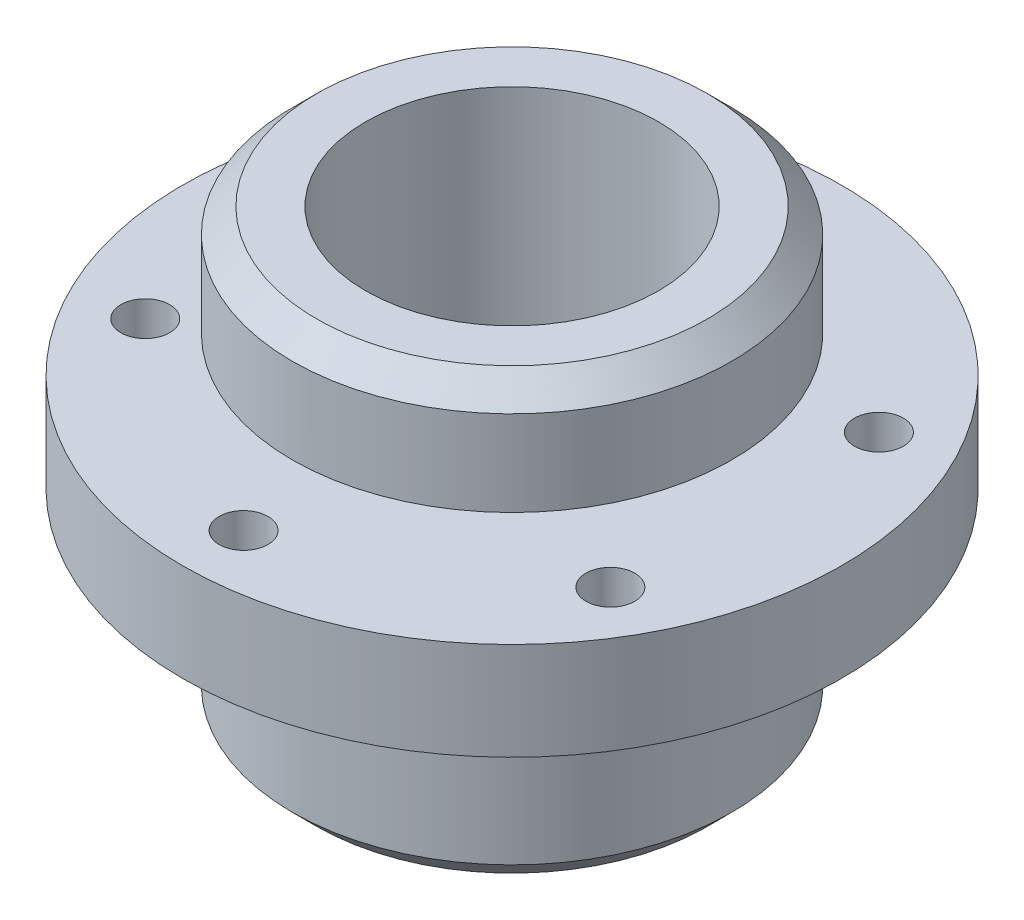
ISO-10303-21;
HEADER;
FILE_DESCRIPTION(('STEP AP214'),'2;1');
FILE_NAME('part.step','',(''),(''),'','','');
FILE_SCHEMA(('AUTOMOTIVE_DESIGN { 1 0 10303 214 1 1 1 1 }'));
ENDSEC;
DATA;
#1=APPLICATION_CONTEXT('core data for automotive mechanical design processes');
#2=APPLICATION_PROTOCOL_DEFINITION('international standard','automotive_design',2000,#1);
#3=PRODUCT_CONTEXT('',#1,'mechanical');
#4=PRODUCT('Part','Part','',(#3));
#5=PRODUCT_RELATED_PRODUCT_CATEGORY('part','',(#4));
#6=PRODUCT_DEFINITION_FORMATION('','',#4);
#7=PRODUCT_DEFINITION_CONTEXT('part definition',#1,'design');
#8=PRODUCT_DEFINITION('design','',#6,#7);
#9=PRODUCT_DEFINITION_SHAPE('','',#8);
#10=(LENGTH_UNIT() NAMED_UNIT(*) SI_UNIT(.MILLI.,.METRE.));
#11=(NAMED_UNIT(*) PLANE_ANGLE_UNIT() SI_UNIT($,.RADIAN.));
#12=(NAMED_UNIT(*) SI_UNIT($,.STERADIAN.) SOLID_ANGLE_UNIT());
#13=UNCERTAINTY_MEASURE_WITH_UNIT(LENGTH_MEASURE(1.E-05),#10,'distance_accuracy_value','');
#14=(GEOMETRIC_REPRESENTATION_CONTEXT(3) GLOBAL_UNCERTAINTY_ASSIGNED_CONTEXT((#13)) GLOBAL_UNIT_ASSIGNED_CONTEXT((#10,
#11,#12)) REPRESENTATION_CONTEXT('',''));
#15=CARTESIAN_POINT('',(0.,0.,0.));
#16=DIRECTION('',(0.,0.,1.));
#17=DIRECTION('',(1.,0.,0.));
#18=AXIS2_PLACEMENT_3D('',#15,#16,#17);
#19=CARTESIAN_POINT('',(0.,63.4080227866128,0.));
#20=DIRECTION('',(0.,1.,0.));
#21=DIRECTION('',(0.,0.,1.));
#22=AXIS2_PLACEMENT_3D('',#19,#20,#21);
#23=CYLINDRICAL_SURFACE('',#22,36.);
#24=CARTESIAN_POINT('',(0.,-42.7154046997389,0.));
#25=DIRECTION('',(0.,1.,0.));
#26=DIRECTION('',(0.,0.,1.));
#27=AXIS2_PLACEMENT_3D('',#24,#25,#26);
#28=CIRCLE('',#27,36.);
#29=CARTESIAN_POINT('',(0.,-42.7154046997389,36.));
#30=VERTEX_POINT('',#29);
#31=EDGE_CURVE('E62',#30,#30,#28,.T.);
#32=ORIENTED_EDGE('',*,*,#31,.T.);
#33=EDGE_LOOP('',(#32));
#34=FACE_BOUND('',#33,.T.);
#35=CARTESIAN_POINT('',(0.,-22.7154046997389,0.));
#36=DIRECTION('',(0.,1.,0.));
#37=DIRECTION('',(0.,0.,1.));
#38=AXIS2_PLACEMENT_3D('',#35,#36,#37);
#39=CIRCLE('',#38,36.);
#40=CARTESIAN_POINT('',(0.,-22.7154046997389,36.));
#41=VERTEX_POINT('',#40);
#42=EDGE_CURVE('E71',#41,#41,#39,.T.);
#43=ORIENTED_EDGE('',*,*,#42,.F.);
#44=EDGE_LOOP('',(#43));
#45=FACE_BOUND('',#44,.T.);
#46=ADVANCED_FACE('F39',(#34,#45),#23,.T.);
#47=CARTESIAN_POINT('',(36.,-22.7154046997389,0.));
#48=DIRECTION('',(0.,-1.,0.));
#49=DIRECTION('',(0.,0.,-1.));
#50=AXIS2_PLACEMENT_3D('',#47,#48,#49);
#51=PLANE('',#50);
#52=CARTESIAN_POINT('',(0.,-22.7154046997389,0.));
#53=DIRECTION('',(0.,-1.,0.));
#54=DIRECTION('',(0.,0.,-1.));
#55=AXIS2_PLACEMENT_3D('',#52,#53,#54);
#56=CIRCLE('',#55,31.1644908616188);
#57=CARTESIAN_POINT('',(0.,-22.7154046997389,-31.1644908616188));
#58=VERTEX_POINT('',#57);
#59=EDGE_CURVE('E50',#58,#58,#56,.T.);
#60=ORIENTED_EDGE('',*,*,#59,.T.);
#61=EDGE_LOOP('',(#60));
#62=FACE_BOUND('',#61,.T.);
#63=ORIENTED_EDGE('',*,*,#42,.T.);
#64=EDGE_LOOP('',(#63));
#65=FACE_BOUND('',#64,.T.);
#66=ADVANCED_FACE('F163',(#62,#65),#51,.F.);
#67=CARTESIAN_POINT('',(0.,63.4080227866128,0.));
#68=DIRECTION('',(0.,1.,0.));
#69=DIRECTION('',(0.,0.,1.));
#70=AXIS2_PLACEMENT_3D('',#67,#68,#69);
#71=CYLINDRICAL_SURFACE('',#70,27.1644908616188);
#72=CARTESIAN_POINT('',(0.,-18.7154046997389,0.));
#73=DIRECTION('',(0.,-1.,0.));
#74=DIRECTION('',(0.,0.,-1.));
#75=AXIS2_PLACEMENT_3D('',#72,#73,#74);
#76=CIRCLE('',#75,27.1644908616188);
#77=CARTESIAN_POINT('',(0.,-18.7154046997389,-27.1644908616188));
#78=VERTEX_POINT('',#77);
#79=EDGE_CURVE('E54',#78,#78,#76,.F.);
#80=ORIENTED_EDGE('',*,*,#79,.T.);
#81=EDGE_LOOP('',(#80));
#82=FACE_BOUND('',#81,.T.);
#83=CARTESIAN_POINT('',(0.,-14.7154046997389,0.));
#84=DIRECTION('',(0.,1.,0.));
#85=DIRECTION('',(0.,0.,1.));
#86=AXIS2_PLACEMENT_3D('',#83,#84,#85);
#87=CIRCLE('',#86,27.1644908616188);
#88=CARTESIAN_POINT('',(0.,-14.7154046997389,27.1644908616188));
#89=VERTEX_POINT('',#88);
#90=EDGE_CURVE('E74',#89,#89,#87,.T.);
#91=ORIENTED_EDGE('',*,*,#90,.F.);
#92=EDGE_LOOP('',(#91));
#93=FACE_BOUND('',#92,.T.);
#94=ADVANCED_FACE('F157',(#82,#93),#71,.T.);
#95=CARTESIAN_POINT('',(27.1644908616188,-14.7154046997389,0.));
#96=DIRECTION('',(0.,1.,0.));
#97=DIRECTION('',(0.,0.,1.));
#98=AXIS2_PLACEMENT_3D('',#95,#96,#97);
#99=PLANE('',#98);
#100=CARTESIAN_POINT('',(38.105117766515,-14.7154046997389,-22.0000000000004));
#101=DIRECTION('',(0.,1.,0.));
#102=DIRECTION('',(0.,0.,1.));
#103=AXIS2_PLACEMENT_3D('',#100,#101,#102);
#104=CIRCLE('',#103,4.);
#105=CARTESIAN_POINT('',(38.105117766515,-14.7154046997389,-18.0000000000004));
#106=VERTEX_POINT('',#105);
#107=EDGE_CURVE('E108',#106,#106,#104,.F.);
#108=ORIENTED_EDGE('',*,*,#107,.F.);
#109=EDGE_LOOP('',(#108));
#110=FACE_BOUND('',#109,.T.);
#111=CARTESIAN_POINT('',(38.1051177665155,-14.7154046997389,21.9999999999996));
#112=DIRECTION('',(0.,1.,0.));
#113=DIRECTION('',(0.,0.,1.));
#114=AXIS2_PLACEMENT_3D('',#111,#112,#113);
#115=CIRCLE('',#114,4.);
#116=CARTESIAN_POINT('',(38.1051177665155,-14.7154046997389,25.9999999999996));
#117=VERTEX_POINT('',#116);
#118=EDGE_CURVE('E115',#117,#117,#115,.F.);
#119=ORIENTED_EDGE('',*,*,#118,.F.);
#120=EDGE_LOOP('',(#119));
#121=FACE_BOUND('',#120,.T.);
#122=CARTESIAN_POINT('',(0.,-14.7154046997389,44.));
#123=DIRECTION('',(0.,1.,0.));
#124=DIRECTION('',(0.,0.,1.));
#125=AXIS2_PLACEMENT_3D('',#122,#123,#124);
#126=CIRCLE('',#125,4.);
#127=CARTESIAN_POINT('',(0.,-14.7154046997389,48.));
#128=VERTEX_POINT('',#127);
#129=EDGE_CURVE('E121',#128,#128,#126,.F.);
#130=ORIENTED_EDGE('',*,*,#129,.F.);
#131=EDGE_LOOP('',(#130));
#132=FACE_BOUND('',#131,.T.);
#133=CARTESIAN_POINT('',(-38.1051177665152,-14.7154046997389,22.0000000000002));
#134=DIRECTION('',(0.,1.,0.));
#135=DIRECTION('',(0.,0.,1.));
#136=AXIS2_PLACEMENT_3D('',#133,#134,#135);
#137=CIRCLE('',#136,4.);
#138=CARTESIAN_POINT('',(-38.1051177665152,-14.7154046997389,26.0000000000002));
#139=VERTEX_POINT('',#138);
#140=EDGE_CURVE('E107',#139,#139,#137,.F.);
#141=ORIENTED_EDGE('',*,*,#140,.F.);
#142=EDGE_LOOP('',(#141));
#143=FACE_BOUND('',#142,.T.);
#144=CARTESIAN_POINT('',(-38.1051177665153,-14.7154046997389,-21.9999999999999));
#145=DIRECTION('',(0.,1.,0.));
#146=DIRECTION('',(0.,0.,1.));
#147=AXIS2_PLACEMENT_3D('',#144,#145,#146);
#148=CIRCLE('',#147,4.);
#149=CARTESIAN_POINT('',(-38.1051177665153,-14.7154046997389,-17.9999999999999));
#150=VERTEX_POINT('',#149);
#151=EDGE_CURVE('E101',#150,#150,#148,.F.);
#152=ORIENTED_EDGE('',*,*,#151,.F.);
#153=EDGE_LOOP('',(#152));
#154=FACE_BOUND('',#153,.T.);
#155=CARTESIAN_POINT('',(0.,-14.7154046997389,-44.));
#156=DIRECTION('',(0.,1.,0.));
#157=DIRECTION('',(0.,0.,1.));
#158=AXIS2_PLACEMENT_3D('',#155,#156,#157);
#159=CIRCLE('',#158,4.);
#160=CARTESIAN_POINT('',(0.,-14.7154046997389,-40.));
#161=VERTEX_POINT('',#160);
#162=EDGE_CURVE('E95',#161,#161,#159,.F.);
#163=ORIENTED_EDGE('',*,*,#162,.F.);
#164=EDGE_LOOP('',(#163));
#165=FACE_BOUND('',#164,.T.);
#166=CARTESIAN_POINT('',(0.,-14.7154046997389,0.));
#167=DIRECTION('',(0.,1.,0.));
#168=DIRECTION('',(0.,0.,1.));
#169=AXIS2_PLACEMENT_3D('',#166,#167,#168);
#170=CIRCLE('',#169,54.);
#171=CARTESIAN_POINT('',(0.,-14.7154046997389,54.));
#172=VERTEX_POINT('',#171);
#173=EDGE_CURVE('E77',#172,#172,#170,.T.);
#174=ORIENTED_EDGE('',*,*,#173,.F.);
#175=EDGE_LOOP('',(#174));
#176=FACE_BOUND('',#175,.T.);
#177=ORIENTED_EDGE('',*,*,#90,.T.);
#178=EDGE_LOOP('',(#177));
#179=FACE_BOUND('',#178,.T.);
#180=ADVANCED_FACE('F151',(#110,#121,#132,#143,#154,#165,#176,#179),#99,.F.);
#181=CARTESIAN_POINT('',(0.,63.4080227866128,0.));
#182=DIRECTION('',(0.,1.,0.));
#183=DIRECTION('',(0.,0.,1.));
#184=AXIS2_PLACEMENT_3D('',#181,#182,#183);
#185=CYLINDRICAL_SURFACE('',#184,54.);
#186=CARTESIAN_POINT('',(0.,1.28459530026111,0.));
#187=DIRECTION('',(0.,1.,0.));
#188=DIRECTION('',(0.,0.,1.));
#189=AXIS2_PLACEMENT_3D('',#186,#187,#188);
#190=CIRCLE('',#189,54.);
#191=CARTESIAN_POINT('',(0.,1.28459530026111,54.));
#192=VERTEX_POINT('',#191);
#193=EDGE_CURVE('E80',#192,#192,#190,.T.);
#194=ORIENTED_EDGE('',*,*,#193,.F.);
#195=EDGE_LOOP('',(#194));
#196=FACE_BOUND('',#195,.T.);
#197=ORIENTED_EDGE('',*,*,#173,.T.);
#198=EDGE_LOOP('',(#197));
#199=FACE_BOUND('',#198,.T.);
#200=ADVANCED_FACE('F138',(#196,#199),#185,.T.);
#201=CARTESIAN_POINT('',(54.,1.28459530026111,0.));
#202=DIRECTION('',(0.,-1.,0.));
#203=DIRECTION('',(0.,0.,-1.));
#204=AXIS2_PLACEMENT_3D('',#201,#202,#203);
#205=PLANE('',#204);
#206=CARTESIAN_POINT('',(38.105117766515,1.28459530026111,-22.0000000000004));
#207=DIRECTION('',(0.,1.,0.));
#208=DIRECTION('',(-0.866025403784433,0.,0.50000000000001));
#209=AXIS2_PLACEMENT_3D('',#206,#207,#208);
#210=CIRCLE('',#209,4.);
#211=CARTESIAN_POINT('',(34.6410161513773,1.28459530026111,-20.0000000000004));
#212=VERTEX_POINT('',#211);
#213=EDGE_CURVE('E112',#212,#212,#210,.T.);
#214=ORIENTED_EDGE('',*,*,#213,.F.);
#215=EDGE_LOOP('',(#214));
#216=FACE_BOUND('',#215,.T.);
#217=CARTESIAN_POINT('',(38.1051177665155,1.28459530026111,21.9999999999996));
#218=DIRECTION('',(0.,1.,0.));
#219=DIRECTION('',(-0.866025403784443,0.,-0.499999999999992));
#220=AXIS2_PLACEMENT_3D('',#217,#218,#219);
#221=CIRCLE('',#220,4.);
#222=CARTESIAN_POINT('',(34.6410161513777,1.28459530026111,19.9999999999997));
#223=VERTEX_POINT('',#222);
#224=EDGE_CURVE('E111',#223,#223,#221,.T.);
#225=ORIENTED_EDGE('',*,*,#224,.F.);
#226=EDGE_LOOP('',(#225));
#227=FACE_BOUND('',#226,.T.);
#228=CARTESIAN_POINT('',(0.,1.28459530026111,44.));
#229=DIRECTION('',(0.,1.,0.));
#230=DIRECTION('',(0.,0.,-1.));
#231=AXIS2_PLACEMENT_3D('',#228,#229,#230);
#232=CIRCLE('',#231,4.);
#233=CARTESIAN_POINT('',(0.,1.28459530026111,40.));
#234=VERTEX_POINT('',#233);
#235=EDGE_CURVE('E118',#234,#234,#232,.T.);
#236=ORIENTED_EDGE('',*,*,#235,.F.);
#237=EDGE_LOOP('',(#236));
#238=FACE_BOUND('',#237,.T.);
#239=CARTESIAN_POINT('',(-38.1051177665152,1.28459530026111,22.0000000000002));
#240=DIRECTION('',(0.,1.,0.));
#241=DIRECTION('',(0.866025403784436,0.,-0.500000000000004));
#242=AXIS2_PLACEMENT_3D('',#239,#240,#241);
#243=CIRCLE('',#242,4.);
#244=CARTESIAN_POINT('',(-34.6410161513775,1.28459530026111,20.0000000000002));
#245=VERTEX_POINT('',#244);
#246=EDGE_CURVE('E124',#245,#245,#243,.T.);
#247=ORIENTED_EDGE('',*,*,#246,.F.);
#248=EDGE_LOOP('',(#247));
#249=FACE_BOUND('',#248,.T.);
#250=CARTESIAN_POINT('',(-38.1051177665153,1.28459530026111,-21.9999999999999));
#251=DIRECTION('',(0.,1.,0.));
#252=DIRECTION('',(0.86602540378444,0.,0.499999999999998));
#253=AXIS2_PLACEMENT_3D('',#250,#251,#252);
#254=CIRCLE('',#253,4.);
#255=CARTESIAN_POINT('',(-34.6410161513776,1.28459530026111,-19.9999999999999));
#256=VERTEX_POINT('',#255);
#257=EDGE_CURVE('E104',#256,#256,#254,.T.);
#258=ORIENTED_EDGE('',*,*,#257,.F.);
#259=EDGE_LOOP('',(#258));
#260=FACE_BOUND('',#259,.T.);
#261=CARTESIAN_POINT('',(0.,1.28459530026111,-44.));
#262=DIRECTION('',(0.,1.,0.));
#263=DIRECTION('',(0.,0.,1.));
#264=AXIS2_PLACEMENT_3D('',#261,#262,#263);
#265=CIRCLE('',#264,4.);
#266=CARTESIAN_POINT('',(0.,1.28459530026111,-40.));
#267=VERTEX_POINT('',#266);
#268=EDGE_CURVE('E98',#267,#267,#265,.T.);
#269=ORIENTED_EDGE('',*,*,#268,.F.);
#270=EDGE_LOOP('',(#269));
#271=FACE_BOUND('',#270,.T.);
#272=CARTESIAN_POINT('',(0.,1.28459530026111,0.));
#273=DIRECTION('',(0.,1.,0.));
#274=DIRECTION('',(0.,0.,1.));
#275=AXIS2_PLACEMENT_3D('',#272,#273,#274);
#276=CIRCLE('',#275,27.1644908616188);
#277=CARTESIAN_POINT('',(0.,1.28459530026111,27.1644908616188));
#278=VERTEX_POINT('',#277);
#279=EDGE_CURVE('E83',#278,#278,#276,.T.);
#280=ORIENTED_EDGE('',*,*,#279,.F.);
#281=EDGE_LOOP('',(#280));
#282=FACE_BOUND('',#281,.T.);
#283=ORIENTED_EDGE('',*,*,#193,.T.);
#284=EDGE_LOOP('',(#283));
#285=FACE_BOUND('',#284,.T.);
#286=ADVANCED_FACE('F134',(#216,#227,#238,#249,#260,#271,#282,#285),#205,.F.);
#287=CARTESIAN_POINT('',(0.,63.4080227866128,0.));
#288=DIRECTION('',(0.,1.,0.));
#289=DIRECTION('',(0.,0.,1.));
#290=AXIS2_PLACEMENT_3D('',#287,#288,#289);
#291=CYLINDRICAL_SURFACE('',#290,27.1644908616188);
#292=CARTESIAN_POINT('',(0.,3.28459530026111,0.));
#293=DIRECTION('',(0.,1.,0.));
#294=DIRECTION('',(0.,0.,1.));
#295=AXIS2_PLACEMENT_3D('',#292,#293,#294);
#296=CIRCLE('',#295,27.1644908616188);
#297=CARTESIAN_POINT('',(0.,3.28459530026111,27.1644908616188));
#298=VERTEX_POINT('',#297);
#299=EDGE_CURVE('E10',#298,#298,#296,.F.);
#300=ORIENTED_EDGE('',*,*,#299,.T.);
#301=EDGE_LOOP('',(#300));
#302=FACE_BOUND('',#301,.T.);
#303=ORIENTED_EDGE('',*,*,#279,.T.);
#304=EDGE_LOOP('',(#303));
#305=FACE_BOUND('',#304,.T.);
#306=ADVANCED_FACE('F137',(#302,#305),#291,.T.);
#307=CARTESIAN_POINT('',(27.1644908616188,7.28459530026111,0.));
#308=DIRECTION('',(0.,1.,0.));
#309=DIRECTION('',(0.,0.,1.));
#310=AXIS2_PLACEMENT_3D('',#307,#308,#309);
#311=PLANE('',#310);
#312=CARTESIAN_POINT('',(0.,7.28459530026111,0.));
#313=DIRECTION('',(0.,1.,0.));
#314=DIRECTION('',(0.,0.,1.));
#315=AXIS2_PLACEMENT_3D('',#312,#313,#314);
#316=CIRCLE('',#315,31.1644908616188);
#317=CARTESIAN_POINT('',(0.,7.28459530026111,31.1644908616188));
#318=VERTEX_POINT('',#317);
#319=EDGE_CURVE('E46',#318,#318,#316,.T.);
#320=ORIENTED_EDGE('',*,*,#319,.T.);
#321=EDGE_LOOP('',(#320));
#322=FACE_BOUND('',#321,.T.);
#323=CARTESIAN_POINT('',(0.,7.28459530026111,0.));
#324=DIRECTION('',(0.,1.,0.));
#325=DIRECTION('',(0.,0.,1.));
#326=AXIS2_PLACEMENT_3D('',#323,#324,#325);
#327=CIRCLE('',#326,36.);
#328=CARTESIAN_POINT('',(0.,7.28459530026111,36.));
#329=VERTEX_POINT('',#328);
#330=EDGE_CURVE('E86',#329,#329,#327,.T.);
#331=ORIENTED_EDGE('',*,*,#330,.F.);
#332=EDGE_LOOP('',(#331));
#333=FACE_BOUND('',#332,.T.);
#334=ADVANCED_FACE('F213',(#322,#333),#311,.F.);
#335=CARTESIAN_POINT('',(0.,63.4080227866128,0.));
#336=DIRECTION('',(0.,1.,0.));
#337=DIRECTION('',(0.,0.,1.));
#338=AXIS2_PLACEMENT_3D('',#335,#336,#337);
#339=CYLINDRICAL_SURFACE('',#338,36.);
#340=CARTESIAN_POINT('',(0.,21.2845953002611,0.));
#341=DIRECTION('',(0.,-1.,0.));
#342=DIRECTION('',(0.,0.,-1.));
#343=AXIS2_PLACEMENT_3D('',#340,#341,#342);
#344=CIRCLE('',#343,36.);
#345=CARTESIAN_POINT('',(0.,21.2845953002611,-36.));
#346=VERTEX_POINT('',#345);
#347=EDGE_CURVE('E65',#346,#346,#344,.T.);
#348=ORIENTED_EDGE('',*,*,#347,.T.);
#349=EDGE_LOOP('',(#348));
#350=FACE_BOUND('',#349,.T.);
#351=ORIENTED_EDGE('',*,*,#330,.T.);
#352=EDGE_LOOP('',(#351));
#353=FACE_BOUND('',#352,.T.);
#354=ADVANCED_FACE('F216',(#350,#353),#339,.T.);
#355=CARTESIAN_POINT('',(36.,25.2845953002611,0.));
#356=DIRECTION('',(0.,-1.,0.));
#357=DIRECTION('',(0.,0.,-1.));
#358=AXIS2_PLACEMENT_3D('',#355,#356,#357);
#359=PLANE('',#358);
#360=CARTESIAN_POINT('',(0.,25.2845953002611,0.));
#361=DIRECTION('',(0.,-1.,0.));
#362=DIRECTION('',(0.,0.,-1.));
#363=AXIS2_PLACEMENT_3D('',#360,#361,#362);
#364=CIRCLE('',#363,32.);
#365=CARTESIAN_POINT('',(0.,25.2845953002611,-32.));
#366=VERTEX_POINT('',#365);
#367=EDGE_CURVE('E68',#366,#366,#364,.F.);
#368=ORIENTED_EDGE('',*,*,#367,.T.);
#369=EDGE_LOOP('',(#368));
#370=FACE_BOUND('',#369,.T.);
#371=CARTESIAN_POINT('',(0.,25.2845953002611,0.));
#372=DIRECTION('',(0.,1.,0.));
#373=DIRECTION('',(0.,0.,1.));
#374=AXIS2_PLACEMENT_3D('',#371,#372,#373);
#375=CIRCLE('',#374,24.);
#376=CARTESIAN_POINT('',(0.,25.2845953002611,24.));
#377=VERTEX_POINT('',#376);
#378=EDGE_CURVE('E89',#377,#377,#375,.T.);
#379=ORIENTED_EDGE('',*,*,#378,.F.);
#380=EDGE_LOOP('',(#379));
#381=FACE_BOUND('',#380,.T.);
#382=ADVANCED_FACE('F348',(#370,#381),#359,.F.);
#383=CARTESIAN_POINT('',(0.,63.4080227866128,0.));
#384=DIRECTION('',(0.,1.,0.));
#385=DIRECTION('',(0.,0.,1.));
#386=AXIS2_PLACEMENT_3D('',#383,#384,#385);
#387=CYLINDRICAL_SURFACE('',#386,24.);
#388=CARTESIAN_POINT('',(0.,-46.7154046997389,0.));
#389=DIRECTION('',(0.,1.,0.));
#390=DIRECTION('',(0.,0.,1.));
#391=AXIS2_PLACEMENT_3D('',#388,#389,#390);
#392=CIRCLE('',#391,24.);
#393=CARTESIAN_POINT('',(0.,-46.7154046997389,24.));
#394=VERTEX_POINT('',#393);
#395=EDGE_CURVE('E92',#394,#394,#392,.T.);
#396=ORIENTED_EDGE('',*,*,#395,.F.);
#397=EDGE_LOOP('',(#396));
#398=FACE_BOUND('',#397,.T.);
#399=ORIENTED_EDGE('',*,*,#378,.T.);
#400=EDGE_LOOP('',(#399));
#401=FACE_BOUND('',#400,.T.);
#402=ADVANCED_FACE('F274',(#398,#401),#387,.F.);
#403=CARTESIAN_POINT('',(24.,-46.7154046997389,0.));
#404=DIRECTION('',(0.,1.,0.));
#405=DIRECTION('',(0.,0.,1.));
#406=AXIS2_PLACEMENT_3D('',#403,#404,#405);
#407=PLANE('',#406);
#408=CARTESIAN_POINT('',(0.,-46.7154046997389,0.));
#409=DIRECTION('',(0.,1.,0.));
#410=DIRECTION('',(0.,0.,1.));
#411=AXIS2_PLACEMENT_3D('',#408,#409,#410);
#412=CIRCLE('',#411,32.);
#413=CARTESIAN_POINT('',(0.,-46.7154046997389,32.));
#414=VERTEX_POINT('',#413);
#415=EDGE_CURVE('E59',#414,#414,#412,.F.);
#416=ORIENTED_EDGE('',*,*,#415,.T.);
#417=EDGE_LOOP('',(#416));
#418=FACE_BOUND('',#417,.T.);
#419=ORIENTED_EDGE('',*,*,#395,.T.);
#420=EDGE_LOOP('',(#419));
#421=FACE_BOUND('',#420,.T.);
#422=ADVANCED_FACE('F270',(#418,#421),#407,.F.);
#423=CARTESIAN_POINT('',(0.,-26.0291131987236,-44.));
#424=DIRECTION('',(0.,1.,0.));
#425=DIRECTION('',(0.,0.,1.));
#426=AXIS2_PLACEMENT_3D('',#423,#424,#425);
#427=CYLINDRICAL_SURFACE('',#426,4.);
#428=ORIENTED_EDGE('',*,*,#162,.T.);
#429=EDGE_LOOP('',(#428));
#430=FACE_BOUND('',#429,.T.);
#431=ORIENTED_EDGE('',*,*,#268,.T.);
#432=EDGE_LOOP('',(#431));
#433=FACE_BOUND('',#432,.T.);
#434=ADVANCED_FACE('F273',(#430,#433),#427,.F.);
#435=CARTESIAN_POINT('',(-38.1051177665153,-26.0291131987236,-21.9999999999999));
#436=DIRECTION('',(0.,1.,0.));
#437=DIRECTION('',(0.,0.,1.));
#438=AXIS2_PLACEMENT_3D('',#435,#436,#437);
#439=CYLINDRICAL_SURFACE('',#438,4.);
#440=ORIENTED_EDGE('',*,*,#151,.T.);
#441=EDGE_LOOP('',(#440));
#442=FACE_BOUND('',#441,.T.);
#443=ORIENTED_EDGE('',*,*,#257,.T.);
#444=EDGE_LOOP('',(#443));
#445=FACE_BOUND('',#444,.T.);
#446=ADVANCED_FACE('F291',(#442,#445),#439,.F.);
#447=CARTESIAN_POINT('',(-38.1051177665152,-26.0291131987237,22.0000000000002));
#448=DIRECTION('',(0.,1.,0.));
#449=DIRECTION('',(0.,0.,1.));
#450=AXIS2_PLACEMENT_3D('',#447,#448,#449);
#451=CYLINDRICAL_SURFACE('',#450,4.);
#452=ORIENTED_EDGE('',*,*,#140,.T.);
#453=EDGE_LOOP('',(#452));
#454=FACE_BOUND('',#453,.T.);
#455=ORIENTED_EDGE('',*,*,#246,.T.);
#456=EDGE_LOOP('',(#455));
#457=FACE_BOUND('',#456,.T.);
#458=ADVANCED_FACE('F132',(#454,#457),#451,.F.);
#459=CARTESIAN_POINT('',(0.,-26.0291131987236,44.));
#460=DIRECTION('',(0.,1.,0.));
#461=DIRECTION('',(0.,0.,1.));
#462=AXIS2_PLACEMENT_3D('',#459,#460,#461);
#463=CYLINDRICAL_SURFACE('',#462,4.);
#464=ORIENTED_EDGE('',*,*,#129,.T.);
#465=EDGE_LOOP('',(#464));
#466=FACE_BOUND('',#465,.T.);
#467=ORIENTED_EDGE('',*,*,#235,.T.);
#468=EDGE_LOOP('',(#467));
#469=FACE_BOUND('',#468,.T.);
#470=ADVANCED_FACE('F309',(#466,#469),#463,.F.);
#471=CARTESIAN_POINT('',(38.1051177665155,-26.0291131987236,21.9999999999996));
#472=DIRECTION('',(0.,1.,0.));
#473=DIRECTION('',(0.,0.,1.));
#474=AXIS2_PLACEMENT_3D('',#471,#472,#473);
#475=CYLINDRICAL_SURFACE('',#474,4.);
#476=ORIENTED_EDGE('',*,*,#118,.T.);
#477=EDGE_LOOP('',(#476));
#478=FACE_BOUND('',#477,.T.);
#479=ORIENTED_EDGE('',*,*,#224,.T.);
#480=EDGE_LOOP('',(#479));
#481=FACE_BOUND('',#480,.T.);
#482=ADVANCED_FACE('F319',(#478,#481),#475,.F.);
#483=CARTESIAN_POINT('',(38.105117766515,-26.0291131987236,-22.0000000000004));
#484=DIRECTION('',(0.,1.,0.));
#485=DIRECTION('',(0.,0.,1.));
#486=AXIS2_PLACEMENT_3D('',#483,#484,#485);
#487=CYLINDRICAL_SURFACE('',#486,4.);
#488=ORIENTED_EDGE('',*,*,#107,.T.);
#489=EDGE_LOOP('',(#488));
#490=FACE_BOUND('',#489,.T.);
#491=ORIENTED_EDGE('',*,*,#213,.T.);
#492=EDGE_LOOP('',(#491));
#493=FACE_BOUND('',#492,.T.);
#494=ADVANCED_FACE('F188',(#490,#493),#487,.F.);
#495=CARTESIAN_POINT('',(0.,25.2845953002611,0.));
#496=DIRECTION('',(0.,-1.,0.));
#497=DIRECTION('',(0.,0.,-1.));
#498=AXIS2_PLACEMENT_3D('',#495,#496,#497);
#499=CONICAL_SURFACE('',#498,32.,0.78539816339745);
#500=ORIENTED_EDGE('',*,*,#347,.F.);
#501=EDGE_LOOP('',(#500));
#502=FACE_BOUND('',#501,.T.);
#503=ORIENTED_EDGE('',*,*,#367,.F.);
#504=EDGE_LOOP('',(#503));
#505=FACE_BOUND('',#504,.T.);
#506=ADVANCED_FACE('F182',(#502,#505),#499,.T.);
#507=CARTESIAN_POINT('',(0.,-42.7154046997389,0.));
#508=DIRECTION('',(0.,1.,0.));
#509=DIRECTION('',(0.,0.,1.));
#510=AXIS2_PLACEMENT_3D('',#507,#508,#509);
#511=CONICAL_SURFACE('',#510,36.,0.78539816339745);
#512=ORIENTED_EDGE('',*,*,#415,.F.);
#513=EDGE_LOOP('',(#512));
#514=FACE_BOUND('',#513,.T.);
#515=ORIENTED_EDGE('',*,*,#31,.F.);
#516=EDGE_LOOP('',(#515));
#517=FACE_BOUND('',#516,.T.);
#518=ADVANCED_FACE('F187',(#514,#517),#511,.T.);
#519=CARTESIAN_POINT('',(0.,-18.7154046997389,0.));
#520=DIRECTION('',(0.,-1.,0.));
#521=DIRECTION('',(0.,0.,-1.));
#522=AXIS2_PLACEMENT_3D('',#519,#520,#521);
#523=TOROIDAL_SURFACE('',#522,31.1644908616188,4.);
#524=ORIENTED_EDGE('',*,*,#59,.F.);
#525=EDGE_LOOP('',(#524));
#526=FACE_BOUND('',#525,.T.);
#527=ORIENTED_EDGE('',*,*,#79,.F.);
#528=EDGE_LOOP('',(#527));
#529=FACE_BOUND('',#528,.T.);
#530=ADVANCED_FACE('F193',(#526,#529),#523,.F.);
#531=CARTESIAN_POINT('',(0.,3.28459530026111,0.));
#532=DIRECTION('',(0.,1.,0.));
#533=DIRECTION('',(0.,0.,1.));
#534=AXIS2_PLACEMENT_3D('',#531,#532,#533);
#535=TOROIDAL_SURFACE('',#534,31.1644908616188,4.);
#536=ORIENTED_EDGE('',*,*,#299,.F.);
#537=EDGE_LOOP('',(#536));
#538=FACE_BOUND('',#537,.T.);
#539=ORIENTED_EDGE('',*,*,#319,.F.);
#540=EDGE_LOOP('',(#539));
#541=FACE_BOUND('',#540,.T.);
#542=ADVANCED_FACE('F41',(#538,#541),#535,.F.);
#543=CLOSED_SHELL('',(#46,#66,#94,#180,#200,#286,#306,#334,#354,#382,#402,#422,#434,#446,#458,
#470,#482,#494,#506,#518,#530,#542));
#544=MANIFOLD_SOLID_BREP('B2',#543);
#545=ADVANCED_BREP_SHAPE_REPRESENTATION('',(#18,#544),#14);
#546=SHAPE_DEFINITION_REPRESENTATION(#9,#545);
ENDSEC;
END-ISO-10303-21;
